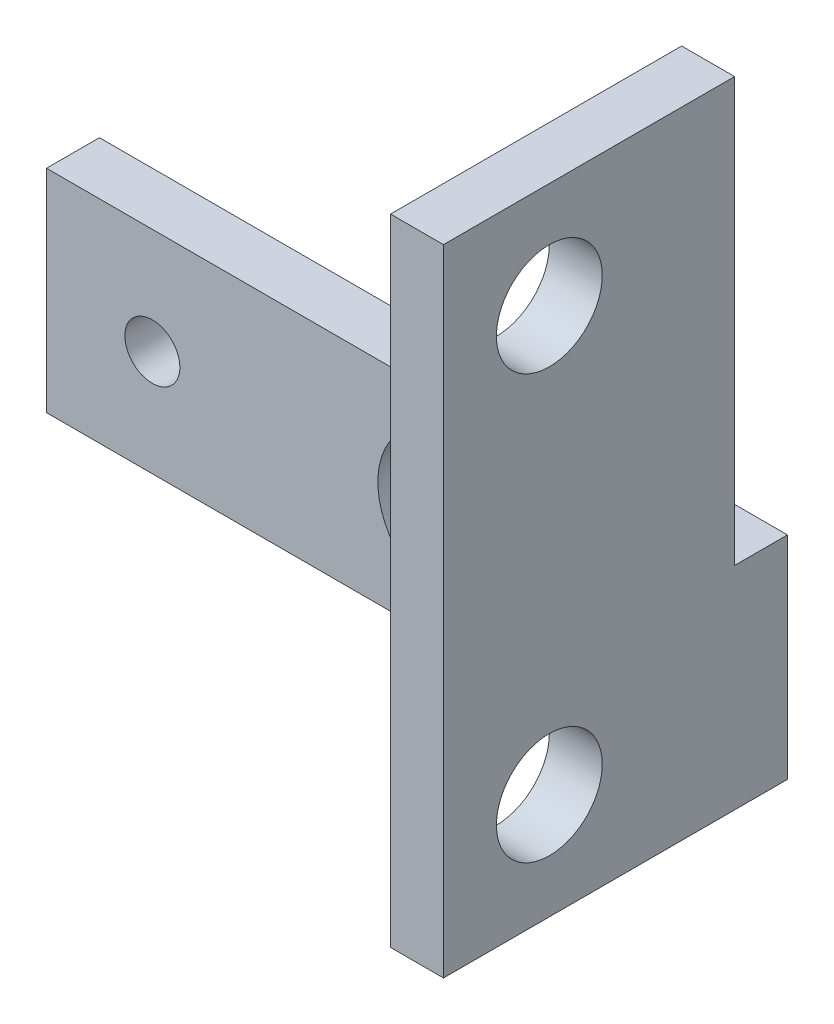
ISO-10303-21;
HEADER;
FILE_DESCRIPTION(('STEP AP214'),'2;1');
FILE_NAME('part.step','',(''),(''),'','','');
FILE_SCHEMA(('AUTOMOTIVE_DESIGN { 1 0 10303 214 1 1 1 1 }'));
ENDSEC;
DATA;
#1=APPLICATION_CONTEXT('core data for automotive mechanical design processes');
#2=APPLICATION_PROTOCOL_DEFINITION('international standard','automotive_design',2000,#1);
#3=PRODUCT_CONTEXT('',#1,'mechanical');
#4=PRODUCT('Part','Part','',(#3));
#5=PRODUCT_RELATED_PRODUCT_CATEGORY('part','',(#4));
#6=PRODUCT_DEFINITION_FORMATION('','',#4);
#7=PRODUCT_DEFINITION_CONTEXT('part definition',#1,'design');
#8=PRODUCT_DEFINITION('design','',#6,#7);
#9=PRODUCT_DEFINITION_SHAPE('','',#8);
#10=(LENGTH_UNIT() NAMED_UNIT(*) SI_UNIT(.MILLI.,.METRE.));
#11=(NAMED_UNIT(*) PLANE_ANGLE_UNIT() SI_UNIT($,.RADIAN.));
#12=(NAMED_UNIT(*) SI_UNIT($,.STERADIAN.) SOLID_ANGLE_UNIT());
#13=UNCERTAINTY_MEASURE_WITH_UNIT(LENGTH_MEASURE(1.E-05),#10,'distance_accuracy_value','');
#14=(GEOMETRIC_REPRESENTATION_CONTEXT(3) GLOBAL_UNCERTAINTY_ASSIGNED_CONTEXT((#13)) GLOBAL_UNIT_ASSIGNED_CONTEXT((#10,
#11,#12)) REPRESENTATION_CONTEXT('',''));
#15=CARTESIAN_POINT('',(0.,0.,0.));
#16=DIRECTION('',(0.,0.,1.));
#17=DIRECTION('',(1.,0.,0.));
#18=AXIS2_PLACEMENT_3D('',#15,#16,#17);
#19=CARTESIAN_POINT('',(82.55,25.4,6.35));
#20=DIRECTION('',(0.,-1.,0.));
#21=DIRECTION('',(1.,0.,0.));
#22=AXIS2_PLACEMENT_3D('',#19,#20,#21);
#23=PLANE('',#22);
#24=DIRECTION('',(-1.,0.,0.));
#25=VECTOR('',#24,1.);
#26=CARTESIAN_POINT('',(76.2,25.4,6.35));
#27=LINE('',#26,#25);
#28=CARTESIAN_POINT('',(82.55,25.4,6.35));
#29=VERTEX_POINT('',#28);
#30=CARTESIAN_POINT('',(76.2,25.4,6.35));
#31=VERTEX_POINT('',#30);
#32=EDGE_CURVE('E50',#29,#31,#27,.T.);
#33=ORIENTED_EDGE('',*,*,#32,.F.);
#34=DIRECTION('',(0.,0.,-1.));
#35=VECTOR('',#34,1.);
#36=CARTESIAN_POINT('',(82.55,25.4,6.35));
#37=LINE('',#36,#35);
#38=CARTESIAN_POINT('',(82.55,25.4,0.));
#39=VERTEX_POINT('',#38);
#40=EDGE_CURVE('E79',#29,#39,#37,.T.);
#41=ORIENTED_EDGE('',*,*,#40,.T.);
#42=DIRECTION('',(-1.,0.,0.));
#43=VECTOR('',#42,1.);
#44=CARTESIAN_POINT('',(82.55,25.4,0.));
#45=LINE('',#44,#43);
#46=CARTESIAN_POINT('',(0.,25.4,0.));
#47=VERTEX_POINT('',#46);
#48=EDGE_CURVE('E75',#39,#47,#45,.T.);
#49=ORIENTED_EDGE('',*,*,#48,.T.);
#50=DIRECTION('',(0.,0.,-1.));
#51=VECTOR('',#50,1.);
#52=CARTESIAN_POINT('',(0.,25.4,6.35));
#53=LINE('',#52,#51);
#54=CARTESIAN_POINT('',(0.,25.4,6.35));
#55=VERTEX_POINT('',#54);
#56=EDGE_CURVE('E77',#55,#47,#53,.T.);
#57=ORIENTED_EDGE('',*,*,#56,.F.);
#58=DIRECTION('',(-1.,0.,0.));
#59=VECTOR('',#58,1.);
#60=CARTESIAN_POINT('',(82.55,25.4,6.35));
#61=LINE('',#60,#59);
#62=EDGE_CURVE('E58',#31,#55,#61,.T.);
#63=ORIENTED_EDGE('',*,*,#62,.F.);
#64=EDGE_LOOP('',(#33,#41,#49,#57,#63));
#65=FACE_BOUND('',#64,.T.);
#66=ADVANCED_FACE('F33',(#65),#23,.F.);
#67=CARTESIAN_POINT('',(0.,25.4,6.35));
#68=DIRECTION('',(1.,0.,0.));
#69=DIRECTION('',(0.,1.,0.));
#70=AXIS2_PLACEMENT_3D('',#67,#68,#69);
#71=PLANE('',#70);
#72=DIRECTION('',(0.,-1.,0.));
#73=VECTOR('',#72,1.);
#74=CARTESIAN_POINT('',(0.,25.4,0.));
#75=LINE('',#74,#73);
#76=CARTESIAN_POINT('',(0.,0.,0.));
#77=VERTEX_POINT('',#76);
#78=EDGE_CURVE('E90',#47,#77,#75,.T.);
#79=ORIENTED_EDGE('',*,*,#78,.T.);
#80=DIRECTION('',(0.,0.,-1.));
#81=VECTOR('',#80,1.);
#82=CARTESIAN_POINT('',(0.,0.,6.35));
#83=LINE('',#82,#81);
#84=CARTESIAN_POINT('',(0.,0.,6.35));
#85=VERTEX_POINT('',#84);
#86=EDGE_CURVE('E11',#85,#77,#83,.T.);
#87=ORIENTED_EDGE('',*,*,#86,.F.);
#88=DIRECTION('',(0.,-1.,0.));
#89=VECTOR('',#88,1.);
#90=CARTESIAN_POINT('',(0.,25.4,6.35));
#91=LINE('',#90,#89);
#92=EDGE_CURVE('E84',#55,#85,#91,.T.);
#93=ORIENTED_EDGE('',*,*,#92,.F.);
#94=ORIENTED_EDGE('',*,*,#56,.T.);
#95=EDGE_LOOP('',(#79,#87,#93,#94));
#96=FACE_BOUND('',#95,.T.);
#97=ADVANCED_FACE('F35',(#96),#71,.F.);
#98=CARTESIAN_POINT('',(0.,0.,6.35));
#99=DIRECTION('',(0.,1.,0.));
#100=DIRECTION('',(0.,0.,1.));
#101=AXIS2_PLACEMENT_3D('',#98,#99,#100);
#102=PLANE('',#101);
#103=DIRECTION('',(1.,0.,0.));
#104=VECTOR('',#103,1.);
#105=CARTESIAN_POINT('',(0.,0.,0.));
#106=LINE('',#105,#104);
#107=CARTESIAN_POINT('',(82.55,0.,0.));
#108=VERTEX_POINT('',#107);
#109=EDGE_CURVE('E93',#77,#108,#106,.T.);
#110=ORIENTED_EDGE('',*,*,#109,.T.);
#111=DIRECTION('',(0.,0.,-1.));
#112=VECTOR('',#111,1.);
#113=CARTESIAN_POINT('',(82.55,0.,6.35));
#114=LINE('',#113,#112);
#115=CARTESIAN_POINT('',(82.55,0.,41.275));
#116=VERTEX_POINT('',#115);
#117=EDGE_CURVE('E42',#116,#108,#114,.T.);
#118=ORIENTED_EDGE('',*,*,#117,.F.);
#119=DIRECTION('',(1.,0.,0.));
#120=VECTOR('',#119,1.);
#121=CARTESIAN_POINT('',(76.2,0.,41.275));
#122=LINE('',#121,#120);
#123=CARTESIAN_POINT('',(76.2,0.,41.275));
#124=VERTEX_POINT('',#123);
#125=EDGE_CURVE('E98',#124,#116,#122,.T.);
#126=ORIENTED_EDGE('',*,*,#125,.F.);
#127=DIRECTION('',(0.,0.,-1.));
#128=VECTOR('',#127,1.);
#129=CARTESIAN_POINT('',(76.2,0.,41.275));
#130=LINE('',#129,#128);
#131=CARTESIAN_POINT('',(76.2,0.,6.35));
#132=VERTEX_POINT('',#131);
#133=EDGE_CURVE('E94',#124,#132,#130,.T.);
#134=ORIENTED_EDGE('',*,*,#133,.T.);
#135=DIRECTION('',(1.,0.,0.));
#136=VECTOR('',#135,1.);
#137=CARTESIAN_POINT('',(0.,0.,6.35));
#138=LINE('',#137,#136);
#139=EDGE_CURVE('E256',#85,#132,#138,.T.);
#140=ORIENTED_EDGE('',*,*,#139,.F.);
#141=ORIENTED_EDGE('',*,*,#86,.T.);
#142=EDGE_LOOP('',(#110,#118,#126,#134,#140,#141));
#143=FACE_BOUND('',#142,.T.);
#144=ADVANCED_FACE('F178',(#143),#102,.F.);
#145=CARTESIAN_POINT('',(82.55,0.,6.35));
#146=DIRECTION('',(-1.,0.,0.));
#147=DIRECTION('',(0.,0.,1.));
#148=AXIS2_PLACEMENT_3D('',#145,#146,#147);
#149=PLANE('',#148);
#150=CARTESIAN_POINT('',(82.55,63.5,28.575));
#151=DIRECTION('',(1.,0.,0.));
#152=DIRECTION('',(0.,0.,-1.));
#153=AXIS2_PLACEMENT_3D('',#150,#151,#152);
#154=CIRCLE('',#153,6.35);
#155=CARTESIAN_POINT('',(82.55,63.5,22.225));
#156=VERTEX_POINT('',#155);
#157=EDGE_CURVE('E217',#156,#156,#154,.T.);
#158=ORIENTED_EDGE('',*,*,#157,.F.);
#159=EDGE_LOOP('',(#158));
#160=FACE_BOUND('',#159,.T.);
#161=CARTESIAN_POINT('',(82.55,12.7,28.575));
#162=DIRECTION('',(1.,0.,0.));
#163=DIRECTION('',(0.,0.,-1.));
#164=AXIS2_PLACEMENT_3D('',#161,#162,#163);
#165=CIRCLE('',#164,6.35);
#166=CARTESIAN_POINT('',(82.55,12.7,22.225));
#167=VERTEX_POINT('',#166);
#168=EDGE_CURVE('E130',#167,#167,#165,.T.);
#169=ORIENTED_EDGE('',*,*,#168,.F.);
#170=EDGE_LOOP('',(#169));
#171=FACE_BOUND('',#170,.T.);
#172=DIRECTION('',(0.,1.,0.));
#173=VECTOR('',#172,1.);
#174=CARTESIAN_POINT('',(82.55,0.,0.));
#175=LINE('',#174,#173);
#176=EDGE_CURVE('E85',#108,#39,#175,.T.);
#177=ORIENTED_EDGE('',*,*,#176,.T.);
#178=ORIENTED_EDGE('',*,*,#40,.F.);
#179=DIRECTION('',(0.,-1.,0.));
#180=VECTOR('',#179,1.);
#181=CARTESIAN_POINT('',(82.55,76.2,6.35));
#182=LINE('',#181,#180);
#183=CARTESIAN_POINT('',(82.55,76.2,6.35));
#184=VERTEX_POINT('',#183);
#185=EDGE_CURVE('E125',#184,#29,#182,.T.);
#186=ORIENTED_EDGE('',*,*,#185,.F.);
#187=DIRECTION('',(0.,0.,-1.));
#188=VECTOR('',#187,1.);
#189=CARTESIAN_POINT('',(82.55,76.2,6.35));
#190=LINE('',#189,#188);
#191=CARTESIAN_POINT('',(82.55,76.2,41.275));
#192=VERTEX_POINT('',#191);
#193=EDGE_CURVE('E199',#192,#184,#190,.T.);
#194=ORIENTED_EDGE('',*,*,#193,.F.);
#195=DIRECTION('',(0.,1.,0.));
#196=VECTOR('',#195,1.);
#197=CARTESIAN_POINT('',(82.55,0.,41.275));
#198=LINE('',#197,#196);
#199=EDGE_CURVE('E134',#116,#192,#198,.T.);
#200=ORIENTED_EDGE('',*,*,#199,.F.);
#201=ORIENTED_EDGE('',*,*,#117,.T.);
#202=EDGE_LOOP('',(#177,#178,#186,#194,#200,#201));
#203=FACE_BOUND('',#202,.T.);
#204=ADVANCED_FACE('F182',(#160,#171,#203),#149,.F.);
#205=CARTESIAN_POINT('',(0.,0.,6.35));
#206=DIRECTION('',(0.,0.,1.));
#207=DIRECTION('',(1.,0.,0.));
#208=AXIS2_PLACEMENT_3D('',#205,#206,#207);
#209=PLANE('',#208);
#210=CARTESIAN_POINT('',(48.895,12.7,6.35));
#211=DIRECTION('',(0.,0.,1.));
#212=DIRECTION('',(1.,0.,0.));
#213=AXIS2_PLACEMENT_3D('',#210,#211,#212);
#214=CIRCLE('',#213,9.144);
#215=CARTESIAN_POINT('',(58.039,12.7,6.35));
#216=VERTEX_POINT('',#215);
#217=EDGE_CURVE('E122',#216,#216,#214,.T.);
#218=ORIENTED_EDGE('',*,*,#217,.F.);
#219=EDGE_LOOP('',(#218));
#220=FACE_BOUND('',#219,.T.);
#221=CARTESIAN_POINT('',(12.7,12.7,6.35));
#222=DIRECTION('',(0.,0.,1.));
#223=DIRECTION('',(1.,0.,0.));
#224=AXIS2_PLACEMENT_3D('',#221,#222,#223);
#225=CIRCLE('',#224,3.302);
#226=CARTESIAN_POINT('',(16.002,12.7,6.35));
#227=VERTEX_POINT('',#226);
#228=EDGE_CURVE('E126',#227,#227,#225,.T.);
#229=ORIENTED_EDGE('',*,*,#228,.F.);
#230=EDGE_LOOP('',(#229));
#231=FACE_BOUND('',#230,.T.);
#232=DIRECTION('',(0.,-1.,0.));
#233=VECTOR('',#232,1.);
#234=CARTESIAN_POINT('',(76.2,25.4,6.35));
#235=LINE('',#234,#233);
#236=EDGE_CURVE('E138',#31,#132,#235,.T.);
#237=ORIENTED_EDGE('',*,*,#236,.F.);
#238=ORIENTED_EDGE('',*,*,#62,.T.);
#239=ORIENTED_EDGE('',*,*,#92,.T.);
#240=ORIENTED_EDGE('',*,*,#139,.T.);
#241=EDGE_LOOP('',(#237,#238,#239,#240));
#242=FACE_BOUND('',#241,.T.);
#243=ADVANCED_FACE('F184',(#220,#231,#242),#209,.T.);
#244=CARTESIAN_POINT('',(0.,0.,0.));
#245=DIRECTION('',(0.,0.,1.));
#246=DIRECTION('',(1.,0.,0.));
#247=AXIS2_PLACEMENT_3D('',#244,#245,#246);
#248=PLANE('',#247);
#249=CARTESIAN_POINT('',(48.895,12.7,0.));
#250=DIRECTION('',(0.,0.,1.));
#251=DIRECTION('',(1.,0.,0.));
#252=AXIS2_PLACEMENT_3D('',#249,#250,#251);
#253=CIRCLE('',#252,9.144);
#254=CARTESIAN_POINT('',(58.039,12.7,0.));
#255=VERTEX_POINT('',#254);
#256=EDGE_CURVE('E110',#255,#255,#253,.T.);
#257=ORIENTED_EDGE('',*,*,#256,.T.);
#258=EDGE_LOOP('',(#257));
#259=FACE_BOUND('',#258,.T.);
#260=CARTESIAN_POINT('',(12.7,12.7,0.));
#261=DIRECTION('',(0.,0.,1.));
#262=DIRECTION('',(1.,0.,0.));
#263=AXIS2_PLACEMENT_3D('',#260,#261,#262);
#264=CIRCLE('',#263,3.302);
#265=CARTESIAN_POINT('',(16.002,12.7,0.));
#266=VERTEX_POINT('',#265);
#267=EDGE_CURVE('E129',#266,#266,#264,.T.);
#268=ORIENTED_EDGE('',*,*,#267,.T.);
#269=EDGE_LOOP('',(#268));
#270=FACE_BOUND('',#269,.T.);
#271=ORIENTED_EDGE('',*,*,#78,.F.);
#272=ORIENTED_EDGE('',*,*,#48,.F.);
#273=ORIENTED_EDGE('',*,*,#176,.F.);
#274=ORIENTED_EDGE('',*,*,#109,.F.);
#275=EDGE_LOOP('',(#271,#272,#273,#274));
#276=FACE_BOUND('',#275,.T.);
#277=ADVANCED_FACE('F92',(#259,#270,#276),#248,.F.);
#278=CARTESIAN_POINT('',(76.2,25.4,41.275));
#279=DIRECTION('',(1.,0.,0.));
#280=DIRECTION('',(0.,0.,-1.));
#281=AXIS2_PLACEMENT_3D('',#278,#279,#280);
#282=PLANE('',#281);
#283=CARTESIAN_POINT('',(76.2,63.5,28.575));
#284=DIRECTION('',(1.,0.,0.));
#285=DIRECTION('',(0.,0.,-1.));
#286=AXIS2_PLACEMENT_3D('',#283,#284,#285);
#287=CIRCLE('',#286,6.35);
#288=CARTESIAN_POINT('',(76.2,63.5,22.225));
#289=VERTEX_POINT('',#288);
#290=EDGE_CURVE('E37',#289,#289,#287,.T.);
#291=ORIENTED_EDGE('',*,*,#290,.T.);
#292=EDGE_LOOP('',(#291));
#293=FACE_BOUND('',#292,.T.);
#294=CARTESIAN_POINT('',(76.2,12.7,28.575));
#295=DIRECTION('',(1.,0.,0.));
#296=DIRECTION('',(0.,0.,-1.));
#297=AXIS2_PLACEMENT_3D('',#294,#295,#296);
#298=CIRCLE('',#297,6.35);
#299=CARTESIAN_POINT('',(76.2,12.7,22.225));
#300=VERTEX_POINT('',#299);
#301=EDGE_CURVE('E133',#300,#300,#298,.T.);
#302=ORIENTED_EDGE('',*,*,#301,.T.);
#303=EDGE_LOOP('',(#302));
#304=FACE_BOUND('',#303,.T.);
#305=ORIENTED_EDGE('',*,*,#236,.T.);
#306=ORIENTED_EDGE('',*,*,#133,.F.);
#307=DIRECTION('',(0.,-1.,0.));
#308=VECTOR('',#307,1.);
#309=CARTESIAN_POINT('',(76.2,25.4,41.275));
#310=LINE('',#309,#308);
#311=CARTESIAN_POINT('',(76.2,76.2,41.275));
#312=VERTEX_POINT('',#311);
#313=EDGE_CURVE('E137',#312,#124,#310,.T.);
#314=ORIENTED_EDGE('',*,*,#313,.F.);
#315=DIRECTION('',(0.,0.,1.));
#316=VECTOR('',#315,1.);
#317=CARTESIAN_POINT('',(76.2,76.2,41.275));
#318=LINE('',#317,#316);
#319=CARTESIAN_POINT('',(76.2,76.2,6.35));
#320=VERTEX_POINT('',#319);
#321=EDGE_CURVE('E114',#320,#312,#318,.T.);
#322=ORIENTED_EDGE('',*,*,#321,.F.);
#323=DIRECTION('',(0.,-1.,0.));
#324=VECTOR('',#323,1.);
#325=CARTESIAN_POINT('',(76.2,76.2,6.35));
#326=LINE('',#325,#324);
#327=EDGE_CURVE('E115',#320,#31,#326,.T.);
#328=ORIENTED_EDGE('',*,*,#327,.T.);
#329=EDGE_LOOP('',(#305,#306,#314,#322,#328));
#330=FACE_BOUND('',#329,.T.);
#331=ADVANCED_FACE('F224',(#293,#304,#330),#282,.F.);
#332=CARTESIAN_POINT('',(82.55,25.4,41.275));
#333=DIRECTION('',(0.,0.,1.));
#334=DIRECTION('',(1.,0.,0.));
#335=AXIS2_PLACEMENT_3D('',#332,#333,#334);
#336=PLANE('',#335);
#337=ORIENTED_EDGE('',*,*,#199,.T.);
#338=DIRECTION('',(1.,0.,0.));
#339=VECTOR('',#338,1.);
#340=CARTESIAN_POINT('',(82.55,76.2,41.275));
#341=LINE('',#340,#339);
#342=EDGE_CURVE('E206',#312,#192,#341,.T.);
#343=ORIENTED_EDGE('',*,*,#342,.F.);
#344=ORIENTED_EDGE('',*,*,#313,.T.);
#345=ORIENTED_EDGE('',*,*,#125,.T.);
#346=EDGE_LOOP('',(#337,#343,#344,#345));
#347=FACE_BOUND('',#346,.T.);
#348=ADVANCED_FACE('F170',(#347),#336,.T.);
#349=CARTESIAN_POINT('',(-2.50000000007189E-05,12.7,28.575));
#350=DIRECTION('',(1.,0.,0.));
#351=DIRECTION('',(0.,0.,-1.));
#352=AXIS2_PLACEMENT_3D('',#349,#350,#351);
#353=CYLINDRICAL_SURFACE('',#352,6.35);
#354=ORIENTED_EDGE('',*,*,#168,.T.);
#355=EDGE_LOOP('',(#354));
#356=FACE_BOUND('',#355,.T.);
#357=ORIENTED_EDGE('',*,*,#301,.F.);
#358=EDGE_LOOP('',(#357));
#359=FACE_BOUND('',#358,.T.);
#360=ADVANCED_FACE('F160',(#356,#359),#353,.F.);
#361=CARTESIAN_POINT('',(12.7,12.7,-31.75));
#362=DIRECTION('',(0.,0.,1.));
#363=DIRECTION('',(1.,0.,0.));
#364=AXIS2_PLACEMENT_3D('',#361,#362,#363);
#365=CYLINDRICAL_SURFACE('',#364,3.302);
#366=CARTESIAN_POINT('',(16.002,12.7,6.35));
#367=CARTESIAN_POINT('',(16.002,12.7,6.28385416666667));
#368=CARTESIAN_POINT('',(16.002,12.7,6.21770833333333));
#369=CARTESIAN_POINT('',(16.002,12.7,6.08541666666667));
#370=CARTESIAN_POINT('',(16.002,12.7,6.01927083333334));
#371=CARTESIAN_POINT('',(16.002,12.7,5.88697916666667));
#372=CARTESIAN_POINT('',(16.002,12.7,5.82083333333333));
#373=CARTESIAN_POINT('',(16.002,12.7,5.68854166666667));
#374=CARTESIAN_POINT('',(16.002,12.7,5.62239583333333));
#375=CARTESIAN_POINT('',(16.002,12.7,5.49010416666667));
#376=CARTESIAN_POINT('',(16.002,12.7,5.42395833333333));
#377=CARTESIAN_POINT('',(16.002,12.7,5.29166666666667));
#378=CARTESIAN_POINT('',(16.002,12.7,5.22552083333333));
#379=CARTESIAN_POINT('',(16.002,12.7,5.09322916666667));
#380=CARTESIAN_POINT('',(16.002,12.7,5.02708333333333));
#381=CARTESIAN_POINT('',(16.002,12.7,4.89479166666666));
#382=CARTESIAN_POINT('',(16.002,12.7,4.82864583333333));
#383=CARTESIAN_POINT('',(16.002,12.7,4.69635416666666));
#384=CARTESIAN_POINT('',(16.002,12.7,4.63020833333333));
#385=CARTESIAN_POINT('',(16.002,12.7,4.49791666666667));
#386=CARTESIAN_POINT('',(16.002,12.7,4.43177083333333));
#387=CARTESIAN_POINT('',(16.002,12.7,4.29947916666666));
#388=CARTESIAN_POINT('',(16.002,12.7,4.23333333333333));
#389=CARTESIAN_POINT('',(16.002,12.7,4.10104166666666));
#390=CARTESIAN_POINT('',(16.002,12.7,4.03489583333333));
#391=CARTESIAN_POINT('',(16.002,12.7,3.90260416666667));
#392=CARTESIAN_POINT('',(16.002,12.7,3.83645833333333));
#393=CARTESIAN_POINT('',(16.002,12.7,3.70416666666666));
#394=CARTESIAN_POINT('',(16.002,12.7,3.63802083333333));
#395=CARTESIAN_POINT('',(16.002,12.7,3.50572916666666));
#396=CARTESIAN_POINT('',(16.002,12.7,3.43958333333333));
#397=CARTESIAN_POINT('',(16.002,12.7,3.30729166666667));
#398=CARTESIAN_POINT('',(16.002,12.7,3.24114583333333));
#399=CARTESIAN_POINT('',(16.002,12.7,3.10885416666666));
#400=CARTESIAN_POINT('',(16.002,12.7,3.04270833333333));
#401=CARTESIAN_POINT('',(16.002,12.7,2.91041666666666));
#402=CARTESIAN_POINT('',(16.002,12.7,2.84427083333333));
#403=CARTESIAN_POINT('',(16.002,12.7,2.71197916666667));
#404=CARTESIAN_POINT('',(16.002,12.7,2.64583333333333));
#405=CARTESIAN_POINT('',(16.002,12.7,2.51354166666666));
#406=CARTESIAN_POINT('',(16.002,12.7,2.44739583333333));
#407=CARTESIAN_POINT('',(16.002,12.7,2.31510416666666));
#408=CARTESIAN_POINT('',(16.002,12.7,2.24895833333333));
#409=CARTESIAN_POINT('',(16.002,12.7,2.11666666666666));
#410=CARTESIAN_POINT('',(16.002,12.7,2.05052083333333));
#411=CARTESIAN_POINT('',(16.002,12.7,1.91822916666666));
#412=CARTESIAN_POINT('',(16.002,12.7,1.85208333333333));
#413=CARTESIAN_POINT('',(16.002,12.7,1.71979166666666));
#414=CARTESIAN_POINT('',(16.002,12.7,1.65364583333333));
#415=CARTESIAN_POINT('',(16.002,12.7,1.52135416666666));
#416=CARTESIAN_POINT('',(16.002,12.7,1.45520833333333));
#417=CARTESIAN_POINT('',(16.002,12.7,1.32291666666666));
#418=CARTESIAN_POINT('',(16.002,12.7,1.25677083333333));
#419=CARTESIAN_POINT('',(16.002,12.7,1.12447916666666));
#420=CARTESIAN_POINT('',(16.002,12.7,1.05833333333333));
#421=CARTESIAN_POINT('',(16.002,12.7,0.926041666666664));
#422=CARTESIAN_POINT('',(16.002,12.7,0.85989583333333));
#423=CARTESIAN_POINT('',(16.002,12.7,0.727604166666662));
#424=CARTESIAN_POINT('',(16.002,12.7,0.661458333333328));
#425=CARTESIAN_POINT('',(16.002,12.7,0.529166666666659));
#426=CARTESIAN_POINT('',(16.002,12.7,0.463020833333325));
#427=CARTESIAN_POINT('',(16.002,12.7,0.330729166666659));
#428=CARTESIAN_POINT('',(16.002,12.7,0.264583333333327));
#429=CARTESIAN_POINT('',(16.002,12.7,0.132291666666661));
#430=CARTESIAN_POINT('',(16.002,12.7,0.0661458333333272));
#431=CARTESIAN_POINT('',(16.002,12.7,0.));
#432=B_SPLINE_CURVE_WITH_KNOTS('',3,(#366,#367,#368,#369,#370,#371,#372,#373,#374,#375,#376,
#377,#378,#379,#380,#381,#382,#383,#384,#385,#386,#387,#388,#389,#390,#391,#392,#393,#394,#395,
#396,#397,#398,#399,#400,#401,#402,#403,#404,#405,#406,#407,#408,#409,#410,#411,#412,#413,#414,
#415,#416,#417,#418,#419,#420,#421,#422,#423,#424,#425,#426,#427,#428,#429,#430,#431),
.UNSPECIFIED.,.F.,.F.,(4,2,2,2,2,2,2,2,2,2,2,2,2,2,2,2,2,2,2,2,2,2,2,2,2,2,2,2,2,2,2,2,4),(0.,
0.198437500000002,0.396874999999998,0.5953125,0.793750000000003,0.992187499999998,1.190625,
1.3890625,1.58750000000001,1.7859375,1.984375,2.18281250000001,2.38125,2.5796875,
2.77812500000001,2.9765625,3.175,3.37343750000001,3.571875,3.7703125,3.96875000000001,4.1671875,
4.365625,4.56406250000001,4.7625,4.96093750000001,5.15937500000001,5.3578125,5.55625000000001,
5.75468750000001,5.95312500000001,6.15156250000001,6.35000000000001),.UNSPECIFIED.);
#433=EDGE_CURVE('BSEAM157',#227,#266,#432,.T.);
#434=ORIENTED_EDGE('',*,*,#228,.T.);
#435=ORIENTED_EDGE('',*,*,#267,.F.);
#436=ORIENTED_EDGE('',*,*,#433,.T.);
#437=ORIENTED_EDGE('',*,*,#433,.F.);
#438=EDGE_LOOP('',(#434,#436,#435,#437));
#439=FACE_BOUND('',#438,.T.);
#440=ADVANCED_FACE('F157',(#439),#365,.F.);
#441=CARTESIAN_POINT('',(48.895,12.7,-31.75));
#442=DIRECTION('',(0.,0.,1.));
#443=DIRECTION('',(1.,0.,0.));
#444=AXIS2_PLACEMENT_3D('',#441,#442,#443);
#445=CYLINDRICAL_SURFACE('',#444,9.144);
#446=CARTESIAN_POINT('',(58.039,12.7,6.35));
#447=CARTESIAN_POINT('',(58.039,12.7,6.28385416666667));
#448=CARTESIAN_POINT('',(58.039,12.7,6.21770833333333));
#449=CARTESIAN_POINT('',(58.039,12.7,6.08541666666667));
#450=CARTESIAN_POINT('',(58.039,12.7,6.01927083333334));
#451=CARTESIAN_POINT('',(58.039,12.7,5.88697916666667));
#452=CARTESIAN_POINT('',(58.039,12.7,5.82083333333333));
#453=CARTESIAN_POINT('',(58.039,12.7,5.68854166666667));
#454=CARTESIAN_POINT('',(58.039,12.7,5.62239583333333));
#455=CARTESIAN_POINT('',(58.039,12.7,5.49010416666667));
#456=CARTESIAN_POINT('',(58.039,12.7,5.42395833333333));
#457=CARTESIAN_POINT('',(58.039,12.7,5.29166666666667));
#458=CARTESIAN_POINT('',(58.039,12.7,5.22552083333333));
#459=CARTESIAN_POINT('',(58.039,12.7,5.09322916666667));
#460=CARTESIAN_POINT('',(58.039,12.7,5.02708333333333));
#461=CARTESIAN_POINT('',(58.039,12.7,4.89479166666666));
#462=CARTESIAN_POINT('',(58.039,12.7,4.82864583333333));
#463=CARTESIAN_POINT('',(58.039,12.7,4.69635416666666));
#464=CARTESIAN_POINT('',(58.039,12.7,4.63020833333333));
#465=CARTESIAN_POINT('',(58.039,12.7,4.49791666666667));
#466=CARTESIAN_POINT('',(58.039,12.7,4.43177083333333));
#467=CARTESIAN_POINT('',(58.039,12.7,4.29947916666666));
#468=CARTESIAN_POINT('',(58.039,12.7,4.23333333333333));
#469=CARTESIAN_POINT('',(58.039,12.7,4.10104166666666));
#470=CARTESIAN_POINT('',(58.039,12.7,4.03489583333333));
#471=CARTESIAN_POINT('',(58.039,12.7,3.90260416666667));
#472=CARTESIAN_POINT('',(58.039,12.7,3.83645833333333));
#473=CARTESIAN_POINT('',(58.039,12.7,3.70416666666666));
#474=CARTESIAN_POINT('',(58.039,12.7,3.63802083333333));
#475=CARTESIAN_POINT('',(58.039,12.7,3.50572916666666));
#476=CARTESIAN_POINT('',(58.039,12.7,3.43958333333333));
#477=CARTESIAN_POINT('',(58.039,12.7,3.30729166666667));
#478=CARTESIAN_POINT('',(58.039,12.7,3.24114583333333));
#479=CARTESIAN_POINT('',(58.039,12.7,3.10885416666666));
#480=CARTESIAN_POINT('',(58.039,12.7,3.04270833333333));
#481=CARTESIAN_POINT('',(58.039,12.7,2.91041666666666));
#482=CARTESIAN_POINT('',(58.039,12.7,2.84427083333333));
#483=CARTESIAN_POINT('',(58.039,12.7,2.71197916666667));
#484=CARTESIAN_POINT('',(58.039,12.7,2.64583333333333));
#485=CARTESIAN_POINT('',(58.039,12.7,2.51354166666666));
#486=CARTESIAN_POINT('',(58.039,12.7,2.44739583333333));
#487=CARTESIAN_POINT('',(58.039,12.7,2.31510416666666));
#488=CARTESIAN_POINT('',(58.039,12.7,2.24895833333333));
#489=CARTESIAN_POINT('',(58.039,12.7,2.11666666666666));
#490=CARTESIAN_POINT('',(58.039,12.7,2.05052083333333));
#491=CARTESIAN_POINT('',(58.039,12.7,1.91822916666666));
#492=CARTESIAN_POINT('',(58.039,12.7,1.85208333333333));
#493=CARTESIAN_POINT('',(58.039,12.7,1.71979166666666));
#494=CARTESIAN_POINT('',(58.039,12.7,1.65364583333333));
#495=CARTESIAN_POINT('',(58.039,12.7,1.52135416666666));
#496=CARTESIAN_POINT('',(58.039,12.7,1.45520833333333));
#497=CARTESIAN_POINT('',(58.039,12.7,1.32291666666666));
#498=CARTESIAN_POINT('',(58.039,12.7,1.25677083333333));
#499=CARTESIAN_POINT('',(58.039,12.7,1.12447916666666));
#500=CARTESIAN_POINT('',(58.039,12.7,1.05833333333333));
#501=CARTESIAN_POINT('',(58.039,12.7,0.926041666666664));
#502=CARTESIAN_POINT('',(58.039,12.7,0.85989583333333));
#503=CARTESIAN_POINT('',(58.039,12.7,0.727604166666662));
#504=CARTESIAN_POINT('',(58.039,12.7,0.661458333333328));
#505=CARTESIAN_POINT('',(58.039,12.7,0.529166666666659));
#506=CARTESIAN_POINT('',(58.039,12.7,0.463020833333325));
#507=CARTESIAN_POINT('',(58.039,12.7,0.330729166666659));
#508=CARTESIAN_POINT('',(58.039,12.7,0.264583333333327));
#509=CARTESIAN_POINT('',(58.039,12.7,0.132291666666661));
#510=CARTESIAN_POINT('',(58.039,12.7,0.0661458333333272));
#511=CARTESIAN_POINT('',(58.039,12.7,0.));
#512=B_SPLINE_CURVE_WITH_KNOTS('',3,(#446,#447,#448,#449,#450,#451,#452,#453,#454,#455,#456,
#457,#458,#459,#460,#461,#462,#463,#464,#465,#466,#467,#468,#469,#470,#471,#472,#473,#474,#475,
#476,#477,#478,#479,#480,#481,#482,#483,#484,#485,#486,#487,#488,#489,#490,#491,#492,#493,#494,
#495,#496,#497,#498,#499,#500,#501,#502,#503,#504,#505,#506,#507,#508,#509,#510,#511),
.UNSPECIFIED.,.F.,.F.,(4,2,2,2,2,2,2,2,2,2,2,2,2,2,2,2,2,2,2,2,2,2,2,2,2,2,2,2,2,2,2,2,4),(0.,
0.198437500000002,0.396874999999998,0.5953125,0.793750000000003,0.992187499999998,1.190625,
1.3890625,1.58750000000001,1.7859375,1.984375,2.18281250000001,2.38125,2.5796875,
2.77812500000001,2.9765625,3.175,3.37343750000001,3.571875,3.7703125,3.96875000000001,4.1671875,
4.365625,4.56406250000001,4.7625,4.96093750000001,5.15937500000001,5.3578125,5.55625000000001,
5.75468750000001,5.95312500000001,6.15156250000001,6.35000000000001),.UNSPECIFIED.);
#513=EDGE_CURVE('BSEAM159',#216,#255,#512,.T.);
#514=ORIENTED_EDGE('',*,*,#217,.T.);
#515=ORIENTED_EDGE('',*,*,#256,.F.);
#516=ORIENTED_EDGE('',*,*,#513,.T.);
#517=ORIENTED_EDGE('',*,*,#513,.F.);
#518=EDGE_LOOP('',(#514,#516,#515,#517));
#519=FACE_BOUND('',#518,.T.);
#520=ADVANCED_FACE('F159',(#519),#445,.F.);
#521=CARTESIAN_POINT('',(76.2,76.2,6.35));
#522=DIRECTION('',(0.,0.,1.));
#523=DIRECTION('',(1.,0.,0.));
#524=AXIS2_PLACEMENT_3D('',#521,#522,#523);
#525=PLANE('',#524);
#526=ORIENTED_EDGE('',*,*,#32,.T.);
#527=ORIENTED_EDGE('',*,*,#327,.F.);
#528=DIRECTION('',(-1.,0.,0.));
#529=VECTOR('',#528,1.);
#530=CARTESIAN_POINT('',(76.2,76.2,6.35));
#531=LINE('',#530,#529);
#532=EDGE_CURVE('E120',#184,#320,#531,.T.);
#533=ORIENTED_EDGE('',*,*,#532,.F.);
#534=ORIENTED_EDGE('',*,*,#185,.T.);
#535=EDGE_LOOP('',(#526,#527,#533,#534));
#536=FACE_BOUND('',#535,.T.);
#537=ADVANCED_FACE('F167',(#536),#525,.F.);
#538=CARTESIAN_POINT('',(0.,76.2,0.));
#539=DIRECTION('',(0.,-1.,0.));
#540=DIRECTION('',(0.,0.,-1.));
#541=AXIS2_PLACEMENT_3D('',#538,#539,#540);
#542=PLANE('',#541);
#543=ORIENTED_EDGE('',*,*,#321,.T.);
#544=ORIENTED_EDGE('',*,*,#342,.T.);
#545=ORIENTED_EDGE('',*,*,#193,.T.);
#546=ORIENTED_EDGE('',*,*,#532,.T.);
#547=EDGE_LOOP('',(#543,#544,#545,#546));
#548=FACE_BOUND('',#547,.T.);
#549=ADVANCED_FACE('F211',(#548),#542,.F.);
#550=CARTESIAN_POINT('',(-2.50000000007189E-05,63.5,28.575));
#551=DIRECTION('',(1.,0.,0.));
#552=DIRECTION('',(0.,0.,-1.));
#553=AXIS2_PLACEMENT_3D('',#550,#551,#552);
#554=CYLINDRICAL_SURFACE('',#553,6.35);
#555=ORIENTED_EDGE('',*,*,#157,.T.);
#556=EDGE_LOOP('',(#555));
#557=FACE_BOUND('',#556,.T.);
#558=ORIENTED_EDGE('',*,*,#290,.F.);
#559=EDGE_LOOP('',(#558));
#560=FACE_BOUND('',#559,.T.);
#561=ADVANCED_FACE('F227',(#557,#560),#554,.F.);
#562=CLOSED_SHELL('',(#66,#97,#144,#204,#243,#277,#331,#348,#360,#440,#520,#537,#549,#561));
#563=MANIFOLD_SOLID_BREP('B2',#562);
#564=ADVANCED_BREP_SHAPE_REPRESENTATION('',(#18,#563),#14);
#565=SHAPE_DEFINITION_REPRESENTATION(#9,#564);
ENDSEC;
END-ISO-10303-21;
